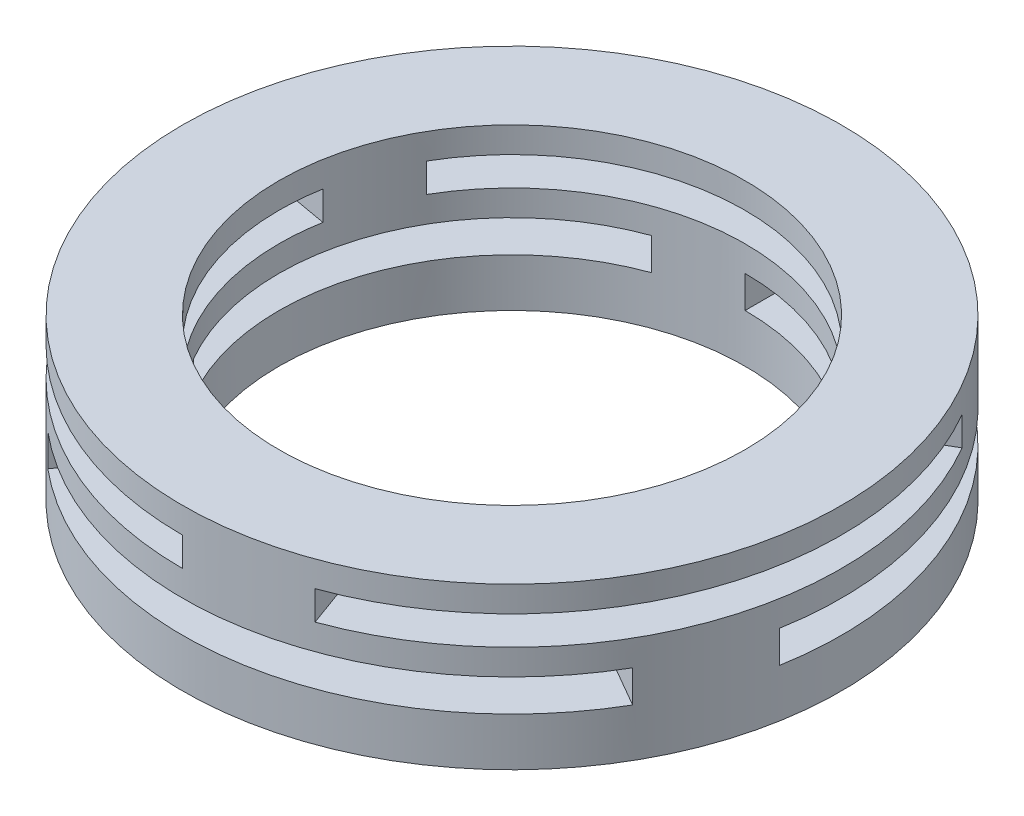
ISO-10303-21;
HEADER;
FILE_DESCRIPTION(('STEP AP214'),'2;1');
FILE_NAME('part.step','',(''),(''),'','','');
FILE_SCHEMA(('AUTOMOTIVE_DESIGN { 1 0 10303 214 1 1 1 1 }'));
ENDSEC;
DATA;
#1=APPLICATION_CONTEXT('core data for automotive mechanical design processes');
#2=APPLICATION_PROTOCOL_DEFINITION('international standard','automotive_design',2000,#1);
#3=PRODUCT_CONTEXT('',#1,'mechanical');
#4=PRODUCT('Part','Part','',(#3));
#5=PRODUCT_RELATED_PRODUCT_CATEGORY('part','',(#4));
#6=PRODUCT_DEFINITION_FORMATION('','',#4);
#7=PRODUCT_DEFINITION_CONTEXT('part definition',#1,'design');
#8=PRODUCT_DEFINITION('design','',#6,#7);
#9=PRODUCT_DEFINITION_SHAPE('','',#8);
#10=(LENGTH_UNIT() NAMED_UNIT(*) SI_UNIT(.MILLI.,.METRE.));
#11=(NAMED_UNIT(*) PLANE_ANGLE_UNIT() SI_UNIT($,.RADIAN.));
#12=(NAMED_UNIT(*) SI_UNIT($,.STERADIAN.) SOLID_ANGLE_UNIT());
#13=UNCERTAINTY_MEASURE_WITH_UNIT(LENGTH_MEASURE(1.E-05),#10,'distance_accuracy_value','');
#14=(GEOMETRIC_REPRESENTATION_CONTEXT(3) GLOBAL_UNCERTAINTY_ASSIGNED_CONTEXT((#13)) GLOBAL_UNIT_ASSIGNED_CONTEXT((#10,
#11,#12)) REPRESENTATION_CONTEXT('',''));
#15=CARTESIAN_POINT('',(0.,0.,0.));
#16=DIRECTION('',(0.,0.,1.));
#17=DIRECTION('',(1.,0.,0.));
#18=AXIS2_PLACEMENT_3D('',#15,#16,#17);
#19=CARTESIAN_POINT('',(3.86795134082924E-13,-112.760074912511,0.));
#20=DIRECTION('',(0.,1.,0.));
#21=DIRECTION('',(-1.,0.,0.));
#22=AXIS2_PLACEMENT_3D('',#19,#20,#21);
#23=CYLINDRICAL_SURFACE('',#22,7.25000000000001);
#24=DIRECTION('',(0.,1.,0.));
#25=VECTOR('',#24,1.);
#26=CARTESIAN_POINT('',(4.37504570732679E-13,-112.760074912511,7.25000000000001));
#27=LINE('',#26,#25);
#28=CARTESIAN_POINT('',(0.,4.19999999999997,7.25000000000001));
#29=VERTEX_POINT('',#28);
#30=CARTESIAN_POINT('',(0.,3.29999999999997,7.25000000000001));
#31=VERTEX_POINT('',#30);
#32=EDGE_CURVE('E239',#29,#31,#27,.F.);
#33=ORIENTED_EDGE('',*,*,#32,.F.);
#34=CARTESIAN_POINT('',(0.,4.19999999999997,0.));
#35=DIRECTION('',(0.,1.,0.));
#36=DIRECTION('',(-1.,0.,0.));
#37=AXIS2_PLACEMENT_3D('',#34,#35,#36);
#38=CIRCLE('',#37,7.25000000000001);
#39=CARTESIAN_POINT('',(-7.13985620933853,4.19999999999994,-1.25894928808522));
#40=VERTEX_POINT('',#39);
#41=EDGE_CURVE('E232',#29,#40,#38,.F.);
#42=ORIENTED_EDGE('',*,*,#41,.T.);
#43=DIRECTION('',(0.,1.,0.));
#44=VECTOR('',#43,1.);
#45=CARTESIAN_POINT('',(-7.13985620933813,-112.760074912511,-1.25894928808522));
#46=LINE('',#45,#44);
#47=CARTESIAN_POINT('',(-7.13985620933853,3.29999999999995,-1.25894928808522));
#48=VERTEX_POINT('',#47);
#49=EDGE_CURVE('E207',#48,#40,#46,.T.);
#50=ORIENTED_EDGE('',*,*,#49,.F.);
#51=CARTESIAN_POINT('',(0.,3.29999999999997,0.));
#52=DIRECTION('',(0.,1.,0.));
#53=DIRECTION('',(-1.,0.,0.));
#54=AXIS2_PLACEMENT_3D('',#51,#52,#53);
#55=CIRCLE('',#54,7.25000000000001);
#56=EDGE_CURVE('E227',#31,#48,#55,.F.);
#57=ORIENTED_EDGE('',*,*,#56,.F.);
#58=EDGE_LOOP('',(#33,#42,#50,#57));
#59=FACE_BOUND('',#58,.T.);
#60=DIRECTION('',(0.,1.,0.));
#61=VECTOR('',#60,1.);
#62=CARTESIAN_POINT('',(-6.27868417743681,-112.760074912511,-3.62499999999999));
#63=LINE('',#62,#61);
#64=CARTESIAN_POINT('',(-6.27868417743721,4.19999999999995,-3.62499999999999));
#65=VERTEX_POINT('',#64);
#66=CARTESIAN_POINT('',(-6.27868417743721,3.29999999999995,-3.62499999999999));
#67=VERTEX_POINT('',#66);
#68=EDGE_CURVE('E279',#65,#67,#63,.F.);
#69=ORIENTED_EDGE('',*,*,#68,.F.);
#70=CARTESIAN_POINT('',(0.,4.19999999999997,0.));
#71=DIRECTION('',(0.,1.,0.));
#72=DIRECTION('',(-1.,0.,0.));
#73=AXIS2_PLACEMENT_3D('',#70,#71,#72);
#74=CIRCLE('',#73,7.25000000000001);
#75=CARTESIAN_POINT('',(4.66021017022741,4.19999999999998,-5.55382221261259));
#76=VERTEX_POINT('',#75);
#77=EDGE_CURVE('E275',#65,#76,#74,.F.);
#78=ORIENTED_EDGE('',*,*,#77,.T.);
#79=DIRECTION('',(0.,1.,0.));
#80=VECTOR('',#79,1.);
#81=CARTESIAN_POINT('',(4.66021017022781,-112.760074912511,-5.55382221261259));
#82=LINE('',#81,#80);
#83=CARTESIAN_POINT('',(4.66021017022741,3.29999999999999,-5.55382221261259));
#84=VERTEX_POINT('',#83);
#85=EDGE_CURVE('E283',#84,#76,#82,.T.);
#86=ORIENTED_EDGE('',*,*,#85,.F.);
#87=CARTESIAN_POINT('',(0.,3.29999999999997,0.));
#88=DIRECTION('',(0.,1.,0.));
#89=DIRECTION('',(-1.,0.,0.));
#90=AXIS2_PLACEMENT_3D('',#87,#88,#89);
#91=CIRCLE('',#90,7.25000000000001);
#92=EDGE_CURVE('E272',#67,#84,#91,.F.);
#93=ORIENTED_EDGE('',*,*,#92,.F.);
#94=EDGE_LOOP('',(#69,#78,#86,#93));
#95=FACE_BOUND('',#94,.T.);
#96=DIRECTION('',(0.,1.,0.));
#97=VECTOR('',#96,1.);
#98=CARTESIAN_POINT('',(6.27868417743758,-112.760074912511,-3.62499999999999));
#99=LINE('',#98,#97);
#100=CARTESIAN_POINT('',(6.27868417743718,4.19999999999999,-3.62499999999999));
#101=VERTEX_POINT('',#100);
#102=CARTESIAN_POINT('',(6.27868417743718,3.29999999999999,-3.62499999999999));
#103=VERTEX_POINT('',#102);
#104=EDGE_CURVE('E321',#101,#103,#99,.F.);
#105=ORIENTED_EDGE('',*,*,#104,.F.);
#106=CARTESIAN_POINT('',(0.,4.19999999999997,0.));
#107=DIRECTION('',(0.,1.,0.));
#108=DIRECTION('',(-1.,0.,0.));
#109=AXIS2_PLACEMENT_3D('',#106,#107,#108);
#110=CIRCLE('',#109,7.25000000000001);
#111=CARTESIAN_POINT('',(2.47964603911105,4.19999999999998,6.81277150069786));
#112=VERTEX_POINT('',#111);
#113=EDGE_CURVE('E317',#101,#112,#110,.F.);
#114=ORIENTED_EDGE('',*,*,#113,.T.);
#115=DIRECTION('',(0.,1.,0.));
#116=VECTOR('',#115,1.);
#117=CARTESIAN_POINT('',(2.47964603911145,-112.760074912511,6.81277150069786));
#118=LINE('',#117,#116);
#119=CARTESIAN_POINT('',(2.47964603911105,3.29999999999998,6.81277150069786));
#120=VERTEX_POINT('',#119);
#121=EDGE_CURVE('E325',#120,#112,#118,.T.);
#122=ORIENTED_EDGE('',*,*,#121,.F.);
#123=CARTESIAN_POINT('',(0.,3.29999999999997,0.));
#124=DIRECTION('',(0.,1.,0.));
#125=DIRECTION('',(-1.,0.,0.));
#126=AXIS2_PLACEMENT_3D('',#123,#124,#125);
#127=CIRCLE('',#126,7.25000000000001);
#128=EDGE_CURVE('E314',#103,#120,#127,.F.);
#129=ORIENTED_EDGE('',*,*,#128,.F.);
#130=EDGE_LOOP('',(#105,#114,#122,#129));
#131=FACE_BOUND('',#130,.T.);
#132=DIRECTION('',(0.,1.,0.));
#133=VECTOR('',#132,1.);
#134=CARTESIAN_POINT('',(6.27868417743761,-112.760074912511,3.62499999999994));
#135=LINE('',#134,#133);
#136=CARTESIAN_POINT('',(6.27868417743721,2.5,3.62499999999994));
#137=VERTEX_POINT('',#136);
#138=CARTESIAN_POINT('',(6.27868417743722,1.5,3.62499999999994));
#139=VERTEX_POINT('',#138);
#140=EDGE_CURVE('E410',#137,#139,#135,.F.);
#141=ORIENTED_EDGE('',*,*,#140,.F.);
#142=CARTESIAN_POINT('',(0.,2.49999999999997,0.));
#143=DIRECTION('',(0.,1.,0.));
#144=DIRECTION('',(-1.,0.,0.));
#145=AXIS2_PLACEMENT_3D('',#142,#143,#144);
#146=CIRCLE('',#145,7.25000000000001);
#147=CARTESIAN_POINT('',(-4.66021017022735,2.49999999999996,5.55382221261266));
#148=VERTEX_POINT('',#147);
#149=EDGE_CURVE('E403',#137,#148,#146,.F.);
#150=ORIENTED_EDGE('',*,*,#149,.T.);
#151=DIRECTION('',(0.,1.,0.));
#152=VECTOR('',#151,1.);
#153=CARTESIAN_POINT('',(-4.66021017022695,-112.760074912511,5.55382221261266));
#154=LINE('',#153,#152);
#155=CARTESIAN_POINT('',(-4.66021017022735,1.49999999999996,5.55382221261266));
#156=VERTEX_POINT('',#155);
#157=EDGE_CURVE('E407',#156,#148,#154,.T.);
#158=ORIENTED_EDGE('',*,*,#157,.F.);
#159=CARTESIAN_POINT('',(0.,1.49999999999997,0.));
#160=DIRECTION('',(0.,1.,0.));
#161=DIRECTION('',(-1.,0.,0.));
#162=AXIS2_PLACEMENT_3D('',#159,#160,#161);
#163=CIRCLE('',#162,7.25000000000001);
#164=EDGE_CURVE('E400',#139,#156,#163,.F.);
#165=ORIENTED_EDGE('',*,*,#164,.F.);
#166=EDGE_LOOP('',(#141,#150,#158,#165));
#167=FACE_BOUND('',#166,.T.);
#168=DIRECTION('',(0.,1.,0.));
#169=VECTOR('',#168,1.);
#170=CARTESIAN_POINT('',(-6.27868417743678,-112.760074912511,3.62500000000003));
#171=LINE('',#170,#169);
#172=CARTESIAN_POINT('',(-6.27868417743718,2.49999999999995,3.62500000000003));
#173=VERTEX_POINT('',#172);
#174=CARTESIAN_POINT('',(-6.27868417743718,1.49999999999995,3.62500000000003));
#175=VERTEX_POINT('',#174);
#176=EDGE_CURVE('E396',#173,#175,#171,.F.);
#177=ORIENTED_EDGE('',*,*,#176,.F.);
#178=CARTESIAN_POINT('',(0.,2.49999999999997,0.));
#179=DIRECTION('',(0.,1.,0.));
#180=DIRECTION('',(-1.,0.,0.));
#181=AXIS2_PLACEMENT_3D('',#178,#179,#180);
#182=CIRCLE('',#181,7.25000000000001);
#183=CARTESIAN_POINT('',(-2.47964603911117,2.49999999999997,-6.81277150069782));
#184=VERTEX_POINT('',#183);
#185=EDGE_CURVE('E389',#173,#184,#182,.F.);
#186=ORIENTED_EDGE('',*,*,#185,.T.);
#187=DIRECTION('',(0.,1.,0.));
#188=VECTOR('',#187,1.);
#189=CARTESIAN_POINT('',(-2.47964603911077,-112.760074912511,-6.81277150069782));
#190=LINE('',#189,#188);
#191=CARTESIAN_POINT('',(-2.47964603911117,1.49999999999997,-6.81277150069782));
#192=VERTEX_POINT('',#191);
#193=EDGE_CURVE('E393',#192,#184,#190,.T.);
#194=ORIENTED_EDGE('',*,*,#193,.F.);
#195=CARTESIAN_POINT('',(0.,1.49999999999997,0.));
#196=DIRECTION('',(0.,1.,0.));
#197=DIRECTION('',(-1.,0.,0.));
#198=AXIS2_PLACEMENT_3D('',#195,#196,#197);
#199=CIRCLE('',#198,7.25000000000001);
#200=EDGE_CURVE('E386',#175,#192,#199,.F.);
#201=ORIENTED_EDGE('',*,*,#200,.F.);
#202=EDGE_LOOP('',(#177,#186,#194,#201));
#203=FACE_BOUND('',#202,.T.);
#204=DIRECTION('',(0.,1.,0.));
#205=VECTOR('',#204,1.);
#206=CARTESIAN_POINT('',(3.86795134082925E-13,-112.760074912511,-7.25000000000001));
#207=LINE('',#206,#205);
#208=CARTESIAN_POINT('',(0.,2.49999999999997,-7.25000000000001));
#209=VERTEX_POINT('',#208);
#210=CARTESIAN_POINT('',(0.,1.49999999999997,-7.25000000000001));
#211=VERTEX_POINT('',#210);
#212=EDGE_CURVE('E453',#209,#211,#207,.F.);
#213=ORIENTED_EDGE('',*,*,#212,.F.);
#214=CARTESIAN_POINT('',(0.,2.49999999999997,0.));
#215=DIRECTION('',(0.,1.,0.));
#216=DIRECTION('',(-1.,0.,0.));
#217=AXIS2_PLACEMENT_3D('',#214,#215,#216);
#218=CIRCLE('',#217,7.25000000000001);
#219=CARTESIAN_POINT('',(7.13985620933851,2.5,1.25894928808522));
#220=VERTEX_POINT('',#219);
#221=EDGE_CURVE('E446',#209,#220,#218,.F.);
#222=ORIENTED_EDGE('',*,*,#221,.T.);
#223=DIRECTION('',(0.,1.,0.));
#224=VECTOR('',#223,1.);
#225=CARTESIAN_POINT('',(7.13985620933891,-112.760074912511,1.25894928808522));
#226=LINE('',#225,#224);
#227=CARTESIAN_POINT('',(7.13985620933852,1.5,1.25894928808522));
#228=VERTEX_POINT('',#227);
#229=EDGE_CURVE('E450',#228,#220,#226,.T.);
#230=ORIENTED_EDGE('',*,*,#229,.F.);
#231=CARTESIAN_POINT('',(0.,1.49999999999997,0.));
#232=DIRECTION('',(0.,1.,0.));
#233=DIRECTION('',(-1.,0.,0.));
#234=AXIS2_PLACEMENT_3D('',#231,#232,#233);
#235=CIRCLE('',#234,7.25000000000001);
#236=EDGE_CURVE('E443',#211,#228,#235,.F.);
#237=ORIENTED_EDGE('',*,*,#236,.F.);
#238=EDGE_LOOP('',(#213,#222,#230,#237));
#239=FACE_BOUND('',#238,.T.);
#240=CARTESIAN_POINT('',(0.,0.,0.));
#241=DIRECTION('',(0.,1.,0.));
#242=DIRECTION('',(-1.,0.,0.));
#243=AXIS2_PLACEMENT_3D('',#240,#241,#242);
#244=CIRCLE('',#243,7.25);
#245=CARTESIAN_POINT('',(-7.25,0.,0.));
#246=VERTEX_POINT('',#245);
#247=EDGE_CURVE('E11',#246,#246,#244,.T.);
#248=ORIENTED_EDGE('',*,*,#247,.F.);
#249=EDGE_LOOP('',(#248));
#250=FACE_BOUND('',#249,.T.);
#251=CARTESIAN_POINT('',(0.,4.99999999999998,0.));
#252=DIRECTION('',(0.,1.,0.));
#253=DIRECTION('',(-1.,0.,0.));
#254=AXIS2_PLACEMENT_3D('',#251,#252,#253);
#255=CIRCLE('',#254,7.25000000000002);
#256=CARTESIAN_POINT('',(-7.25000000000003,4.99999999999995,0.));
#257=VERTEX_POINT('',#256);
#258=EDGE_CURVE('E457',#257,#257,#255,.T.);
#259=ORIENTED_EDGE('',*,*,#258,.T.);
#260=EDGE_LOOP('',(#259));
#261=FACE_BOUND('',#260,.T.);
#262=ADVANCED_FACE('F43',(#59,#95,#131,#167,#203,#239,#250,#261),#23,.F.);
#263=CARTESIAN_POINT('',(7.25,0.,0.));
#264=DIRECTION('',(0.,1.,0.));
#265=DIRECTION('',(-1.,0.,0.));
#266=AXIS2_PLACEMENT_3D('',#263,#264,#265);
#267=PLANE('',#266);
#268=CARTESIAN_POINT('',(0.,0.,0.));
#269=DIRECTION('',(0.,1.,0.));
#270=DIRECTION('',(-1.,0.,0.));
#271=AXIS2_PLACEMENT_3D('',#268,#269,#270);
#272=CIRCLE('',#271,10.25);
#273=CARTESIAN_POINT('',(-10.25,0.,0.));
#274=VERTEX_POINT('',#273);
#275=EDGE_CURVE('E51',#274,#274,#272,.T.);
#276=ORIENTED_EDGE('',*,*,#275,.F.);
#277=EDGE_LOOP('',(#276));
#278=FACE_BOUND('',#277,.T.);
#279=ORIENTED_EDGE('',*,*,#247,.T.);
#280=EDGE_LOOP('',(#279));
#281=FACE_BOUND('',#280,.T.);
#282=ADVANCED_FACE('F469',(#278,#281),#267,.F.);
#283=CARTESIAN_POINT('',(3.86795134082924E-13,-112.760074912511,0.));
#284=DIRECTION('',(0.,1.,0.));
#285=DIRECTION('',(-1.,0.,0.));
#286=AXIS2_PLACEMENT_3D('',#283,#284,#285);
#287=CYLINDRICAL_SURFACE('',#286,10.25);
#288=DIRECTION('',(0.,-1.,0.));
#289=VECTOR('',#288,1.);
#290=CARTESIAN_POINT('',(-10.0942794683752,4.19999999999994,-1.77989382108601));
#291=LINE('',#290,#289);
#292=CARTESIAN_POINT('',(-10.0942794683752,4.19999999999994,-1.77989382108601));
#293=VERTEX_POINT('',#292);
#294=CARTESIAN_POINT('',(-10.0942794683752,3.29999999999993,-1.779893821086));
#295=VERTEX_POINT('',#294);
#296=EDGE_CURVE('E66',#293,#295,#291,.T.);
#297=ORIENTED_EDGE('',*,*,#296,.F.);
#298=CARTESIAN_POINT('',(0.,4.19999999999997,0.));
#299=DIRECTION('',(0.,1.,0.));
#300=DIRECTION('',(0.499999999999992,0.,-0.866025403784443));
#301=AXIS2_PLACEMENT_3D('',#298,#299,#300);
#302=CIRCLE('',#301,10.25);
#303=CARTESIAN_POINT('',(0.,4.19999999999997,10.25));
#304=VERTEX_POINT('',#303);
#305=EDGE_CURVE('E211',#293,#304,#302,.T.);
#306=ORIENTED_EDGE('',*,*,#305,.T.);
#307=DIRECTION('',(0.,-1.,0.));
#308=VECTOR('',#307,1.);
#309=CARTESIAN_POINT('',(0.,4.19999999999997,10.25));
#310=LINE('',#309,#308);
#311=CARTESIAN_POINT('',(0.,3.29999999999997,10.25));
#312=VERTEX_POINT('',#311);
#313=EDGE_CURVE('E228',#304,#312,#310,.T.);
#314=ORIENTED_EDGE('',*,*,#313,.T.);
#315=CARTESIAN_POINT('',(0.,3.29999999999997,0.));
#316=DIRECTION('',(0.,1.,0.));
#317=DIRECTION('',(0.499999999999992,0.,-0.866025403784443));
#318=AXIS2_PLACEMENT_3D('',#315,#316,#317);
#319=CIRCLE('',#318,10.25);
#320=EDGE_CURVE('E225',#295,#312,#319,.T.);
#321=ORIENTED_EDGE('',*,*,#320,.F.);
#322=EDGE_LOOP('',(#297,#306,#314,#321));
#323=FACE_BOUND('',#322,.T.);
#324=DIRECTION('',(0.,-1.,0.));
#325=VECTOR('',#324,1.);
#326=CARTESIAN_POINT('',(6.58857299928704,4.19999999999999,-7.85195554196953));
#327=LINE('',#326,#325);
#328=CARTESIAN_POINT('',(6.58857299928704,4.19999999999999,-7.85195554196953));
#329=VERTEX_POINT('',#328);
#330=CARTESIAN_POINT('',(6.58857299928703,3.29999999999999,-7.85195554196952));
#331=VERTEX_POINT('',#330);
#332=EDGE_CURVE('E269',#329,#331,#327,.T.);
#333=ORIENTED_EDGE('',*,*,#332,.F.);
#334=CARTESIAN_POINT('',(0.,4.19999999999997,0.));
#335=DIRECTION('',(0.,1.,0.));
#336=DIRECTION('',(0.500000000000004,0.,0.866025403784436));
#337=AXIS2_PLACEMENT_3D('',#334,#335,#336);
#338=CIRCLE('',#337,10.25);
#339=CARTESIAN_POINT('',(-8.87676038879054,4.19999999999994,-5.12499999999999));
#340=VERTEX_POINT('',#339);
#341=EDGE_CURVE('E248',#329,#340,#338,.T.);
#342=ORIENTED_EDGE('',*,*,#341,.T.);
#343=DIRECTION('',(0.,-1.,0.));
#344=VECTOR('',#343,1.);
#345=CARTESIAN_POINT('',(-8.87676038879054,4.19999999999994,-5.12499999999999));
#346=LINE('',#345,#344);
#347=CARTESIAN_POINT('',(-8.87676038879053,3.29999999999994,-5.12499999999999));
#348=VERTEX_POINT('',#347);
#349=EDGE_CURVE('E257',#340,#348,#346,.T.);
#350=ORIENTED_EDGE('',*,*,#349,.T.);
#351=CARTESIAN_POINT('',(0.,3.29999999999997,0.));
#352=DIRECTION('',(0.,1.,0.));
#353=DIRECTION('',(0.500000000000004,0.,0.866025403784436));
#354=AXIS2_PLACEMENT_3D('',#351,#352,#353);
#355=CIRCLE('',#354,10.25);
#356=EDGE_CURVE('E261',#331,#348,#355,.T.);
#357=ORIENTED_EDGE('',*,*,#356,.F.);
#358=EDGE_LOOP('',(#333,#342,#350,#357));
#359=FACE_BOUND('',#358,.T.);
#360=DIRECTION('',(0.,-1.,0.));
#361=VECTOR('',#360,1.);
#362=CARTESIAN_POINT('',(3.50570646908804,4.19999999999998,9.6318493630556));
#363=LINE('',#362,#361);
#364=CARTESIAN_POINT('',(3.50570646908804,4.19999999999998,9.6318493630556));
#365=VERTEX_POINT('',#364);
#366=CARTESIAN_POINT('',(3.50570646908804,3.29999999999998,9.63184936305559));
#367=VERTEX_POINT('',#366);
#368=EDGE_CURVE('E311',#365,#367,#363,.T.);
#369=ORIENTED_EDGE('',*,*,#368,.F.);
#370=CARTESIAN_POINT('',(0.,4.19999999999997,0.));
#371=DIRECTION('',(0.,1.,0.));
#372=DIRECTION('',(-1.,0.,0.));
#373=AXIS2_PLACEMENT_3D('',#370,#371,#372);
#374=CIRCLE('',#373,10.25);
#375=CARTESIAN_POINT('',(8.87676038879051,4.2,-5.12499999999999));
#376=VERTEX_POINT('',#375);
#377=EDGE_CURVE('E290',#365,#376,#374,.T.);
#378=ORIENTED_EDGE('',*,*,#377,.T.);
#379=DIRECTION('',(0.,-1.,0.));
#380=VECTOR('',#379,1.);
#381=CARTESIAN_POINT('',(8.87676038879051,4.2,-5.12499999999999));
#382=LINE('',#381,#380);
#383=CARTESIAN_POINT('',(8.87676038879051,3.3,-5.12499999999999));
#384=VERTEX_POINT('',#383);
#385=EDGE_CURVE('E299',#376,#384,#382,.T.);
#386=ORIENTED_EDGE('',*,*,#385,.T.);
#387=CARTESIAN_POINT('',(0.,3.29999999999997,0.));
#388=DIRECTION('',(0.,1.,0.));
#389=DIRECTION('',(-1.,0.,0.));
#390=AXIS2_PLACEMENT_3D('',#387,#388,#389);
#391=CIRCLE('',#390,10.25);
#392=EDGE_CURVE('E303',#367,#384,#391,.T.);
#393=ORIENTED_EDGE('',*,*,#392,.F.);
#394=EDGE_LOOP('',(#369,#378,#386,#393));
#395=FACE_BOUND('',#394,.T.);
#396=DIRECTION('',(0.,-1.,0.));
#397=VECTOR('',#396,1.);
#398=CARTESIAN_POINT('',(-6.58857299928694,2.49999999999995,7.85195554196962));
#399=LINE('',#398,#397);
#400=CARTESIAN_POINT('',(-6.58857299928694,2.49999999999995,7.85195554196962));
#401=VERTEX_POINT('',#400);
#402=CARTESIAN_POINT('',(-6.58857299928693,1.49999999999995,7.85195554196962));
#403=VERTEX_POINT('',#402);
#404=EDGE_CURVE('E341',#401,#403,#399,.T.);
#405=ORIENTED_EDGE('',*,*,#404,.F.);
#406=CARTESIAN_POINT('',(0.,2.49999999999997,0.));
#407=DIRECTION('',(0.,1.,0.));
#408=DIRECTION('',(0.499999999999992,0.,-0.866025403784443));
#409=AXIS2_PLACEMENT_3D('',#406,#407,#408);
#410=CIRCLE('',#409,10.25);
#411=CARTESIAN_POINT('',(8.87676038879055,2.5,5.12499999999993));
#412=VERTEX_POINT('',#411);
#413=EDGE_CURVE('E329',#401,#412,#410,.T.);
#414=ORIENTED_EDGE('',*,*,#413,.T.);
#415=DIRECTION('',(0.,-1.,0.));
#416=VECTOR('',#415,1.);
#417=CARTESIAN_POINT('',(8.87676038879055,2.5,5.12499999999993));
#418=LINE('',#417,#416);
#419=CARTESIAN_POINT('',(8.87676038879055,1.5,5.12499999999993));
#420=VERTEX_POINT('',#419);
#421=EDGE_CURVE('E353',#412,#420,#418,.T.);
#422=ORIENTED_EDGE('',*,*,#421,.T.);
#423=CARTESIAN_POINT('',(0.,1.49999999999997,0.));
#424=DIRECTION('',(0.,1.,0.));
#425=DIRECTION('',(0.499999999999992,0.,-0.866025403784443));
#426=AXIS2_PLACEMENT_3D('',#423,#424,#425);
#427=CIRCLE('',#426,10.25);
#428=EDGE_CURVE('E328',#403,#420,#427,.T.);
#429=ORIENTED_EDGE('',*,*,#428,.F.);
#430=EDGE_LOOP('',(#405,#414,#422,#429));
#431=FACE_BOUND('',#430,.T.);
#432=DIRECTION('',(0.,-1.,0.));
#433=VECTOR('',#432,1.);
#434=CARTESIAN_POINT('',(-3.5057064690882,2.49999999999996,-9.63184936305555));
#435=LINE('',#434,#433);
#436=CARTESIAN_POINT('',(-3.5057064690882,2.49999999999996,-9.63184936305555));
#437=VERTEX_POINT('',#436);
#438=CARTESIAN_POINT('',(-3.5057064690882,1.49999999999996,-9.63184936305554));
#439=VERTEX_POINT('',#438);
#440=EDGE_CURVE('E370',#437,#439,#435,.T.);
#441=ORIENTED_EDGE('',*,*,#440,.F.);
#442=CARTESIAN_POINT('',(0.,2.49999999999997,0.));
#443=DIRECTION('',(0.,1.,0.));
#444=DIRECTION('',(0.500000000000004,0.,0.866025403784436));
#445=AXIS2_PLACEMENT_3D('',#442,#443,#444);
#446=CIRCLE('',#445,10.25);
#447=CARTESIAN_POINT('',(-8.8767603887905,2.49999999999994,5.12500000000005));
#448=VERTEX_POINT('',#447);
#449=EDGE_CURVE('E358',#437,#448,#446,.T.);
#450=ORIENTED_EDGE('',*,*,#449,.T.);
#451=DIRECTION('',(0.,-1.,0.));
#452=VECTOR('',#451,1.);
#453=CARTESIAN_POINT('',(-8.8767603887905,2.49999999999994,5.12500000000005));
#454=LINE('',#453,#452);
#455=CARTESIAN_POINT('',(-8.87676038879049,1.49999999999994,5.12500000000005));
#456=VERTEX_POINT('',#455);
#457=EDGE_CURVE('E382',#448,#456,#454,.T.);
#458=ORIENTED_EDGE('',*,*,#457,.T.);
#459=CARTESIAN_POINT('',(0.,1.49999999999997,0.));
#460=DIRECTION('',(0.,1.,0.));
#461=DIRECTION('',(0.500000000000004,0.,0.866025403784436));
#462=AXIS2_PLACEMENT_3D('',#459,#460,#461);
#463=CIRCLE('',#462,10.25);
#464=EDGE_CURVE('E357',#439,#456,#463,.T.);
#465=ORIENTED_EDGE('',*,*,#464,.F.);
#466=EDGE_LOOP('',(#441,#450,#458,#465));
#467=FACE_BOUND('',#466,.T.);
#468=DIRECTION('',(0.,-1.,0.));
#469=VECTOR('',#468,1.);
#470=CARTESIAN_POINT('',(10.0942794683751,2.5,1.779893821086));
#471=LINE('',#470,#469);
#472=CARTESIAN_POINT('',(10.0942794683751,2.5,1.779893821086));
#473=VERTEX_POINT('',#472);
#474=CARTESIAN_POINT('',(10.0942794683751,1.50000000000001,1.779893821086));
#475=VERTEX_POINT('',#474);
#476=EDGE_CURVE('E427',#473,#475,#471,.T.);
#477=ORIENTED_EDGE('',*,*,#476,.F.);
#478=CARTESIAN_POINT('',(0.,2.49999999999997,0.));
#479=DIRECTION('',(0.,1.,0.));
#480=DIRECTION('',(-1.,0.,0.));
#481=AXIS2_PLACEMENT_3D('',#478,#479,#480);
#482=CIRCLE('',#481,10.25);
#483=CARTESIAN_POINT('',(0.,2.49999999999997,-10.25));
#484=VERTEX_POINT('',#483);
#485=EDGE_CURVE('E415',#473,#484,#482,.T.);
#486=ORIENTED_EDGE('',*,*,#485,.T.);
#487=DIRECTION('',(0.,-1.,0.));
#488=VECTOR('',#487,1.);
#489=CARTESIAN_POINT('',(0.,2.49999999999997,-10.25));
#490=LINE('',#489,#488);
#491=CARTESIAN_POINT('',(0.,1.49999999999997,-10.25));
#492=VERTEX_POINT('',#491);
#493=EDGE_CURVE('E439',#484,#492,#490,.T.);
#494=ORIENTED_EDGE('',*,*,#493,.T.);
#495=CARTESIAN_POINT('',(0.,1.49999999999997,0.));
#496=DIRECTION('',(0.,1.,0.));
#497=DIRECTION('',(-1.,0.,0.));
#498=AXIS2_PLACEMENT_3D('',#495,#496,#497);
#499=CIRCLE('',#498,10.25);
#500=EDGE_CURVE('E414',#475,#492,#499,.T.);
#501=ORIENTED_EDGE('',*,*,#500,.F.);
#502=EDGE_LOOP('',(#477,#486,#494,#501));
#503=FACE_BOUND('',#502,.T.);
#504=CARTESIAN_POINT('',(0.,4.99999999999996,0.));
#505=DIRECTION('',(0.,1.,0.));
#506=DIRECTION('',(-1.,0.,0.));
#507=AXIS2_PLACEMENT_3D('',#504,#505,#506);
#508=CIRCLE('',#507,10.25);
#509=CARTESIAN_POINT('',(-10.25,4.99999999999993,0.));
#510=VERTEX_POINT('',#509);
#511=EDGE_CURVE('E461',#510,#510,#508,.T.);
#512=ORIENTED_EDGE('',*,*,#511,.F.);
#513=EDGE_LOOP('',(#512));
#514=FACE_BOUND('',#513,.T.);
#515=ORIENTED_EDGE('',*,*,#275,.T.);
#516=EDGE_LOOP('',(#515));
#517=FACE_BOUND('',#516,.T.);
#518=ADVANCED_FACE('F223',(#323,#359,#395,#431,#467,#503,#514,#517),#287,.T.);
#519=CARTESIAN_POINT('',(10.25,5.00000000000001,0.));
#520=DIRECTION('',(0.,-1.,0.));
#521=DIRECTION('',(1.,0.,0.));
#522=AXIS2_PLACEMENT_3D('',#519,#520,#521);
#523=PLANE('',#522);
#524=ORIENTED_EDGE('',*,*,#258,.F.);
#525=EDGE_LOOP('',(#524));
#526=FACE_BOUND('',#525,.T.);
#527=ORIENTED_EDGE('',*,*,#511,.T.);
#528=EDGE_LOOP('',(#527));
#529=FACE_BOUND('',#528,.T.);
#530=ADVANCED_FACE('F479',(#526,#529),#523,.F.);
#531=CARTESIAN_POINT('',(0.,2.49999999999997,-10.25));
#532=DIRECTION('',(1.,0.,0.));
#533=DIRECTION('',(0.,1.,0.));
#534=AXIS2_PLACEMENT_3D('',#531,#532,#533);
#535=PLANE('',#534);
#536=ORIENTED_EDGE('',*,*,#212,.T.);
#537=DIRECTION('',(0.,0.,1.));
#538=VECTOR('',#537,1.);
#539=CARTESIAN_POINT('',(0.,1.49999999999997,-10.25));
#540=LINE('',#539,#538);
#541=EDGE_CURVE('E431',#492,#211,#540,.T.);
#542=ORIENTED_EDGE('',*,*,#541,.F.);
#543=ORIENTED_EDGE('',*,*,#493,.F.);
#544=DIRECTION('',(0.,0.,1.));
#545=VECTOR('',#544,1.);
#546=CARTESIAN_POINT('',(0.,2.49999999999997,-10.25));
#547=LINE('',#546,#545);
#548=EDGE_CURVE('E419',#484,#209,#547,.T.);
#549=ORIENTED_EDGE('',*,*,#548,.T.);
#550=EDGE_LOOP('',(#536,#542,#543,#549));
#551=FACE_BOUND('',#550,.T.);
#552=ADVANCED_FACE('F482',(#551),#535,.T.);
#553=CARTESIAN_POINT('',(5.41644264156716,2.49999999999999,0.955064977168098));
#554=DIRECTION('',(0.173648177666927,0.,-0.984807753012209));
#555=DIRECTION('',(-0.984807753012209,0.,-0.173648177666926));
#556=AXIS2_PLACEMENT_3D('',#553,#554,#555);
#557=PLANE('',#556);
#558=ORIENTED_EDGE('',*,*,#229,.T.);
#559=DIRECTION('',(0.984807753012209,0.,0.173648177666926));
#560=VECTOR('',#559,1.);
#561=CARTESIAN_POINT('',(5.41644264156716,2.49999999999999,0.955064977168098));
#562=LINE('',#561,#560);
#563=EDGE_CURVE('E424',#220,#473,#562,.T.);
#564=ORIENTED_EDGE('',*,*,#563,.T.);
#565=ORIENTED_EDGE('',*,*,#476,.T.);
#566=DIRECTION('',(0.984807753012209,0.,0.173648177666926));
#567=VECTOR('',#566,1.);
#568=CARTESIAN_POINT('',(5.41644264156716,1.49999999999999,0.955064977168098));
#569=LINE('',#568,#567);
#570=EDGE_CURVE('E420',#228,#475,#569,.T.);
#571=ORIENTED_EDGE('',*,*,#570,.F.);
#572=EDGE_LOOP('',(#558,#564,#565,#571));
#573=FACE_BOUND('',#572,.T.);
#574=ADVANCED_FACE('F493',(#573),#557,.T.);
#575=CARTESIAN_POINT('',(0.,2.49999999999997,0.));
#576=DIRECTION('',(0.,1.,0.));
#577=DIRECTION('',(-1.,0.,0.));
#578=AXIS2_PLACEMENT_3D('',#575,#576,#577);
#579=PLANE('',#578);
#580=ORIENTED_EDGE('',*,*,#548,.F.);
#581=ORIENTED_EDGE('',*,*,#485,.F.);
#582=ORIENTED_EDGE('',*,*,#563,.F.);
#583=ORIENTED_EDGE('',*,*,#221,.F.);
#584=EDGE_LOOP('',(#580,#581,#582,#583));
#585=FACE_BOUND('',#584,.T.);
#586=ADVANCED_FACE('F497',(#585),#579,.F.);
#587=CARTESIAN_POINT('',(0.,1.49999999999997,0.));
#588=DIRECTION('',(0.,1.,0.));
#589=DIRECTION('',(-1.,0.,0.));
#590=AXIS2_PLACEMENT_3D('',#587,#588,#589);
#591=PLANE('',#590);
#592=ORIENTED_EDGE('',*,*,#236,.T.);
#593=ORIENTED_EDGE('',*,*,#570,.T.);
#594=ORIENTED_EDGE('',*,*,#500,.T.);
#595=ORIENTED_EDGE('',*,*,#541,.T.);
#596=EDGE_LOOP('',(#592,#593,#594,#595));
#597=FACE_BOUND('',#596,.T.);
#598=ADVANCED_FACE('F499',(#597),#591,.T.);
#599=CARTESIAN_POINT('',(-8.8767603887905,2.49999999999994,5.12500000000005));
#600=DIRECTION('',(-0.500000000000004,0.,-0.866025403784436));
#601=DIRECTION('',(-0.866025403784436,0.,0.500000000000004));
#602=AXIS2_PLACEMENT_3D('',#599,#600,#601);
#603=PLANE('',#602);
#604=ORIENTED_EDGE('',*,*,#176,.T.);
#605=DIRECTION('',(0.866025403784436,0.,-0.500000000000004));
#606=VECTOR('',#605,1.);
#607=CARTESIAN_POINT('',(-8.87676038879049,1.49999999999994,5.12500000000005));
#608=LINE('',#607,#606);
#609=EDGE_CURVE('E374',#456,#175,#608,.T.);
#610=ORIENTED_EDGE('',*,*,#609,.F.);
#611=ORIENTED_EDGE('',*,*,#457,.F.);
#612=DIRECTION('',(0.866025403784436,0.,-0.500000000000004));
#613=VECTOR('',#612,1.);
#614=CARTESIAN_POINT('',(-8.8767603887905,2.49999999999994,5.12500000000005));
#615=LINE('',#614,#613);
#616=EDGE_CURVE('E362',#448,#173,#615,.T.);
#617=ORIENTED_EDGE('',*,*,#616,.T.);
#618=EDGE_LOOP('',(#604,#610,#611,#617));
#619=FACE_BOUND('',#618,.T.);
#620=ADVANCED_FACE('F502',(#619),#603,.T.);
#621=CARTESIAN_POINT('',(-1.88111078829124,2.49999999999996,-5.1683094143225));
#622=DIRECTION('',(-0.939692620785906,0.,0.342020143325677));
#623=DIRECTION('',(0.342020143325677,0.,0.939692620785906));
#624=AXIS2_PLACEMENT_3D('',#621,#622,#623);
#625=PLANE('',#624);
#626=ORIENTED_EDGE('',*,*,#193,.T.);
#627=DIRECTION('',(-0.342020143325677,0.,-0.939692620785906));
#628=VECTOR('',#627,1.);
#629=CARTESIAN_POINT('',(-1.88111078829124,2.49999999999996,-5.1683094143225));
#630=LINE('',#629,#628);
#631=EDGE_CURVE('E367',#184,#437,#630,.T.);
#632=ORIENTED_EDGE('',*,*,#631,.T.);
#633=ORIENTED_EDGE('',*,*,#440,.T.);
#634=DIRECTION('',(-0.342020143325677,0.,-0.939692620785906));
#635=VECTOR('',#634,1.);
#636=CARTESIAN_POINT('',(-1.88111078829123,1.49999999999996,-5.1683094143225));
#637=LINE('',#636,#635);
#638=EDGE_CURVE('E363',#192,#439,#637,.T.);
#639=ORIENTED_EDGE('',*,*,#638,.F.);
#640=EDGE_LOOP('',(#626,#632,#633,#639));
#641=FACE_BOUND('',#640,.T.);
#642=ADVANCED_FACE('F509',(#641),#625,.T.);
#643=CARTESIAN_POINT('',(0.,2.49999999999997,0.));
#644=DIRECTION('',(0.,1.,0.));
#645=DIRECTION('',(0.500000000000004,0.,0.866025403784436));
#646=AXIS2_PLACEMENT_3D('',#643,#644,#645);
#647=PLANE('',#646);
#648=ORIENTED_EDGE('',*,*,#616,.F.);
#649=ORIENTED_EDGE('',*,*,#449,.F.);
#650=ORIENTED_EDGE('',*,*,#631,.F.);
#651=ORIENTED_EDGE('',*,*,#185,.F.);
#652=EDGE_LOOP('',(#648,#649,#650,#651));
#653=FACE_BOUND('',#652,.T.);
#654=ADVANCED_FACE('F513',(#653),#647,.F.);
#655=CARTESIAN_POINT('',(0.,1.49999999999997,0.));
#656=DIRECTION('',(0.,1.,0.));
#657=DIRECTION('',(0.500000000000004,0.,0.866025403784436));
#658=AXIS2_PLACEMENT_3D('',#655,#656,#657);
#659=PLANE('',#658);
#660=ORIENTED_EDGE('',*,*,#200,.T.);
#661=ORIENTED_EDGE('',*,*,#638,.T.);
#662=ORIENTED_EDGE('',*,*,#464,.T.);
#663=ORIENTED_EDGE('',*,*,#609,.T.);
#664=EDGE_LOOP('',(#660,#661,#662,#663));
#665=FACE_BOUND('',#664,.T.);
#666=ADVANCED_FACE('F515',(#665),#659,.T.);
#667=CARTESIAN_POINT('',(8.87676038879055,2.5,5.12499999999993));
#668=DIRECTION('',(-0.499999999999992,0.,0.866025403784443));
#669=DIRECTION('',(0.866025403784443,0.,0.499999999999992));
#670=AXIS2_PLACEMENT_3D('',#667,#668,#669);
#671=PLANE('',#670);
#672=ORIENTED_EDGE('',*,*,#140,.T.);
#673=DIRECTION('',(-0.866025403784443,0.,-0.499999999999992));
#674=VECTOR('',#673,1.);
#675=CARTESIAN_POINT('',(8.87676038879055,1.5,5.12499999999993));
#676=LINE('',#675,#674);
#677=EDGE_CURVE('E345',#420,#139,#676,.T.);
#678=ORIENTED_EDGE('',*,*,#677,.F.);
#679=ORIENTED_EDGE('',*,*,#421,.F.);
#680=DIRECTION('',(-0.866025403784443,0.,-0.499999999999992));
#681=VECTOR('',#680,1.);
#682=CARTESIAN_POINT('',(8.87676038879055,2.5,5.12499999999993));
#683=LINE('',#682,#681);
#684=EDGE_CURVE('E333',#412,#137,#683,.T.);
#685=ORIENTED_EDGE('',*,*,#684,.T.);
#686=EDGE_LOOP('',(#672,#678,#679,#685));
#687=FACE_BOUND('',#686,.T.);
#688=ADVANCED_FACE('F518',(#687),#671,.T.);
#689=CARTESIAN_POINT('',(-3.53533185327593,2.49999999999996,4.21324443715444));
#690=DIRECTION('',(0.766044443118986,0.,0.642787609686529));
#691=DIRECTION('',(0.642787609686529,0.,-0.766044443118987));
#692=AXIS2_PLACEMENT_3D('',#689,#690,#691);
#693=PLANE('',#692);
#694=ORIENTED_EDGE('',*,*,#157,.T.);
#695=DIRECTION('',(-0.642787609686529,0.,0.766044443118986));
#696=VECTOR('',#695,1.);
#697=CARTESIAN_POINT('',(-3.53533185327593,2.49999999999996,4.21324443715444));
#698=LINE('',#697,#696);
#699=EDGE_CURVE('E338',#148,#401,#698,.T.);
#700=ORIENTED_EDGE('',*,*,#699,.T.);
#701=ORIENTED_EDGE('',*,*,#404,.T.);
#702=DIRECTION('',(-0.642787609686529,0.,0.766044443118986));
#703=VECTOR('',#702,1.);
#704=CARTESIAN_POINT('',(-3.53533185327593,1.49999999999996,4.21324443715444));
#705=LINE('',#704,#703);
#706=EDGE_CURVE('E334',#156,#403,#705,.T.);
#707=ORIENTED_EDGE('',*,*,#706,.F.);
#708=EDGE_LOOP('',(#694,#700,#701,#707));
#709=FACE_BOUND('',#708,.T.);
#710=ADVANCED_FACE('F525',(#709),#693,.T.);
#711=CARTESIAN_POINT('',(0.,2.49999999999997,0.));
#712=DIRECTION('',(0.,1.,0.));
#713=DIRECTION('',(0.499999999999992,0.,-0.866025403784443));
#714=AXIS2_PLACEMENT_3D('',#711,#712,#713);
#715=PLANE('',#714);
#716=ORIENTED_EDGE('',*,*,#684,.F.);
#717=ORIENTED_EDGE('',*,*,#413,.F.);
#718=ORIENTED_EDGE('',*,*,#699,.F.);
#719=ORIENTED_EDGE('',*,*,#149,.F.);
#720=EDGE_LOOP('',(#716,#717,#718,#719));
#721=FACE_BOUND('',#720,.T.);
#722=ADVANCED_FACE('F529',(#721),#715,.F.);
#723=CARTESIAN_POINT('',(0.,1.49999999999997,0.));
#724=DIRECTION('',(0.,1.,0.));
#725=DIRECTION('',(0.499999999999992,0.,-0.866025403784443));
#726=AXIS2_PLACEMENT_3D('',#723,#724,#725);
#727=PLANE('',#726);
#728=ORIENTED_EDGE('',*,*,#164,.T.);
#729=ORIENTED_EDGE('',*,*,#706,.T.);
#730=ORIENTED_EDGE('',*,*,#428,.T.);
#731=ORIENTED_EDGE('',*,*,#677,.T.);
#732=EDGE_LOOP('',(#728,#729,#730,#731));
#733=FACE_BOUND('',#732,.T.);
#734=ADVANCED_FACE('F531',(#733),#727,.T.);
#735=CARTESIAN_POINT('',(0.,4.19999999999997,0.));
#736=DIRECTION('',(0.93969262078591,0.,-0.342020143325663));
#737=DIRECTION('',(-0.342020143325663,0.,-0.939692620785911));
#738=AXIS2_PLACEMENT_3D('',#735,#736,#737);
#739=PLANE('',#738);
#740=ORIENTED_EDGE('',*,*,#121,.T.);
#741=DIRECTION('',(0.342020143325663,0.,0.93969262078591));
#742=VECTOR('',#741,1.);
#743=CARTESIAN_POINT('',(0.,4.19999999999997,0.));
#744=LINE('',#743,#742);
#745=EDGE_CURVE('E287',#112,#365,#744,.T.);
#746=ORIENTED_EDGE('',*,*,#745,.T.);
#747=ORIENTED_EDGE('',*,*,#368,.T.);
#748=DIRECTION('',(0.342020143325663,0.,0.93969262078591));
#749=VECTOR('',#748,1.);
#750=CARTESIAN_POINT('',(0.,3.29999999999997,0.));
#751=LINE('',#750,#749);
#752=EDGE_CURVE('E286',#120,#367,#751,.T.);
#753=ORIENTED_EDGE('',*,*,#752,.F.);
#754=EDGE_LOOP('',(#740,#746,#747,#753));
#755=FACE_BOUND('',#754,.T.);
#756=ADVANCED_FACE('F534',(#755),#739,.T.);
#757=CARTESIAN_POINT('',(0.,4.19999999999997,0.));
#758=DIRECTION('',(0.499999999999998,0.,0.86602540378444));
#759=DIRECTION('',(0.86602540378444,0.,-0.499999999999998));
#760=AXIS2_PLACEMENT_3D('',#757,#758,#759);
#761=PLANE('',#760);
#762=ORIENTED_EDGE('',*,*,#104,.T.);
#763=DIRECTION('',(-0.86602540378444,0.,0.499999999999998));
#764=VECTOR('',#763,1.);
#765=CARTESIAN_POINT('',(0.,3.29999999999997,0.));
#766=LINE('',#765,#764);
#767=EDGE_CURVE('E291',#384,#103,#766,.T.);
#768=ORIENTED_EDGE('',*,*,#767,.F.);
#769=ORIENTED_EDGE('',*,*,#385,.F.);
#770=DIRECTION('',(-0.86602540378444,0.,0.499999999999998));
#771=VECTOR('',#770,1.);
#772=CARTESIAN_POINT('',(0.,4.19999999999997,0.));
#773=LINE('',#772,#771);
#774=EDGE_CURVE('E295',#376,#101,#773,.T.);
#775=ORIENTED_EDGE('',*,*,#774,.T.);
#776=EDGE_LOOP('',(#762,#768,#769,#775));
#777=FACE_BOUND('',#776,.T.);
#778=ADVANCED_FACE('F541',(#777),#761,.T.);
#779=CARTESIAN_POINT('',(0.,4.19999999999997,0.));
#780=DIRECTION('',(0.,1.,0.));
#781=DIRECTION('',(-1.,0.,0.));
#782=AXIS2_PLACEMENT_3D('',#779,#780,#781);
#783=PLANE('',#782);
#784=ORIENTED_EDGE('',*,*,#774,.F.);
#785=ORIENTED_EDGE('',*,*,#377,.F.);
#786=ORIENTED_EDGE('',*,*,#745,.F.);
#787=ORIENTED_EDGE('',*,*,#113,.F.);
#788=EDGE_LOOP('',(#784,#785,#786,#787));
#789=FACE_BOUND('',#788,.T.);
#790=ADVANCED_FACE('F545',(#789),#783,.F.);
#791=CARTESIAN_POINT('',(0.,3.29999999999997,0.));
#792=DIRECTION('',(0.,1.,0.));
#793=DIRECTION('',(-1.,0.,0.));
#794=AXIS2_PLACEMENT_3D('',#791,#792,#793);
#795=PLANE('',#794);
#796=ORIENTED_EDGE('',*,*,#128,.T.);
#797=ORIENTED_EDGE('',*,*,#752,.T.);
#798=ORIENTED_EDGE('',*,*,#392,.T.);
#799=ORIENTED_EDGE('',*,*,#767,.T.);
#800=EDGE_LOOP('',(#796,#797,#798,#799));
#801=FACE_BOUND('',#800,.T.);
#802=ADVANCED_FACE('F547',(#801),#795,.T.);
#803=CARTESIAN_POINT('',(0.,4.19999999999997,0.));
#804=DIRECTION('',(-0.766044443118977,0.,-0.64278760968654));
#805=DIRECTION('',(-0.64278760968654,0.,0.766044443118977));
#806=AXIS2_PLACEMENT_3D('',#803,#804,#805);
#807=PLANE('',#806);
#808=ORIENTED_EDGE('',*,*,#85,.T.);
#809=DIRECTION('',(0.642787609686541,0.,-0.766044443118977));
#810=VECTOR('',#809,1.);
#811=CARTESIAN_POINT('',(0.,4.19999999999997,0.));
#812=LINE('',#811,#810);
#813=EDGE_CURVE('E245',#76,#329,#812,.T.);
#814=ORIENTED_EDGE('',*,*,#813,.T.);
#815=ORIENTED_EDGE('',*,*,#332,.T.);
#816=DIRECTION('',(0.642787609686541,0.,-0.766044443118977));
#817=VECTOR('',#816,1.);
#818=CARTESIAN_POINT('',(0.,3.29999999999997,0.));
#819=LINE('',#818,#817);
#820=EDGE_CURVE('E244',#84,#331,#819,.T.);
#821=ORIENTED_EDGE('',*,*,#820,.F.);
#822=EDGE_LOOP('',(#808,#814,#815,#821));
#823=FACE_BOUND('',#822,.T.);
#824=ADVANCED_FACE('F550',(#823),#807,.T.);
#825=CARTESIAN_POINT('',(0.,4.19999999999997,0.));
#826=DIRECTION('',(0.499999999999998,0.,-0.86602540378444));
#827=DIRECTION('',(-0.86602540378444,0.,-0.499999999999998));
#828=AXIS2_PLACEMENT_3D('',#825,#826,#827);
#829=PLANE('',#828);
#830=ORIENTED_EDGE('',*,*,#68,.T.);
#831=DIRECTION('',(0.86602540378444,0.,0.499999999999998));
#832=VECTOR('',#831,1.);
#833=CARTESIAN_POINT('',(0.,3.29999999999997,0.));
#834=LINE('',#833,#832);
#835=EDGE_CURVE('E249',#348,#67,#834,.T.);
#836=ORIENTED_EDGE('',*,*,#835,.F.);
#837=ORIENTED_EDGE('',*,*,#349,.F.);
#838=DIRECTION('',(0.86602540378444,0.,0.499999999999998));
#839=VECTOR('',#838,1.);
#840=CARTESIAN_POINT('',(0.,4.19999999999997,0.));
#841=LINE('',#840,#839);
#842=EDGE_CURVE('E253',#340,#65,#841,.T.);
#843=ORIENTED_EDGE('',*,*,#842,.T.);
#844=EDGE_LOOP('',(#830,#836,#837,#843));
#845=FACE_BOUND('',#844,.T.);
#846=ADVANCED_FACE('F557',(#845),#829,.T.);
#847=CARTESIAN_POINT('',(0.,4.19999999999997,0.));
#848=DIRECTION('',(0.,1.,0.));
#849=DIRECTION('',(0.500000000000004,0.,0.866025403784436));
#850=AXIS2_PLACEMENT_3D('',#847,#848,#849);
#851=PLANE('',#850);
#852=ORIENTED_EDGE('',*,*,#842,.F.);
#853=ORIENTED_EDGE('',*,*,#341,.F.);
#854=ORIENTED_EDGE('',*,*,#813,.F.);
#855=ORIENTED_EDGE('',*,*,#77,.F.);
#856=EDGE_LOOP('',(#852,#853,#854,#855));
#857=FACE_BOUND('',#856,.T.);
#858=ADVANCED_FACE('F561',(#857),#851,.F.);
#859=CARTESIAN_POINT('',(0.,3.29999999999997,0.));
#860=DIRECTION('',(0.,1.,0.));
#861=DIRECTION('',(0.500000000000004,0.,0.866025403784436));
#862=AXIS2_PLACEMENT_3D('',#859,#860,#861);
#863=PLANE('',#862);
#864=ORIENTED_EDGE('',*,*,#92,.T.);
#865=ORIENTED_EDGE('',*,*,#820,.T.);
#866=ORIENTED_EDGE('',*,*,#356,.T.);
#867=ORIENTED_EDGE('',*,*,#835,.T.);
#868=EDGE_LOOP('',(#864,#865,#866,#867));
#869=FACE_BOUND('',#868,.T.);
#870=ADVANCED_FACE('F563',(#869),#863,.T.);
#871=CARTESIAN_POINT('',(0.,4.19999999999997,0.));
#872=DIRECTION('',(-0.173648177666927,0.,0.984807753012209));
#873=DIRECTION('',(0.984807753012209,0.,0.173648177666927));
#874=AXIS2_PLACEMENT_3D('',#871,#872,#873);
#875=PLANE('',#874);
#876=ORIENTED_EDGE('',*,*,#49,.T.);
#877=DIRECTION('',(-0.984807753012209,0.,-0.173648177666927));
#878=VECTOR('',#877,1.);
#879=CARTESIAN_POINT('',(0.,4.19999999999997,0.));
#880=LINE('',#879,#878);
#881=EDGE_CURVE('E203',#40,#293,#880,.T.);
#882=ORIENTED_EDGE('',*,*,#881,.T.);
#883=ORIENTED_EDGE('',*,*,#296,.T.);
#884=DIRECTION('',(-0.984807753012209,0.,-0.173648177666927));
#885=VECTOR('',#884,1.);
#886=CARTESIAN_POINT('',(0.,3.29999999999997,0.));
#887=LINE('',#886,#885);
#888=EDGE_CURVE('E803',#48,#295,#887,.T.);
#889=ORIENTED_EDGE('',*,*,#888,.F.);
#890=EDGE_LOOP('',(#876,#882,#883,#889));
#891=FACE_BOUND('',#890,.T.);
#892=ADVANCED_FACE('F205',(#891),#875,.T.);
#893=CARTESIAN_POINT('',(0.,4.19999999999997,0.));
#894=DIRECTION('',(-1.,0.,0.));
#895=DIRECTION('',(0.,0.,1.));
#896=AXIS2_PLACEMENT_3D('',#893,#894,#895);
#897=PLANE('',#896);
#898=ORIENTED_EDGE('',*,*,#32,.T.);
#899=DIRECTION('',(0.,0.,-1.));
#900=VECTOR('',#899,1.);
#901=CARTESIAN_POINT('',(0.,3.29999999999997,0.));
#902=LINE('',#901,#900);
#903=EDGE_CURVE('E58',#312,#31,#902,.T.);
#904=ORIENTED_EDGE('',*,*,#903,.F.);
#905=ORIENTED_EDGE('',*,*,#313,.F.);
#906=DIRECTION('',(0.,0.,-1.));
#907=VECTOR('',#906,1.);
#908=CARTESIAN_POINT('',(0.,4.19999999999997,0.));
#909=LINE('',#908,#907);
#910=EDGE_CURVE('E217',#304,#29,#909,.T.);
#911=ORIENTED_EDGE('',*,*,#910,.T.);
#912=EDGE_LOOP('',(#898,#904,#905,#911));
#913=FACE_BOUND('',#912,.T.);
#914=ADVANCED_FACE('F572',(#913),#897,.T.);
#915=CARTESIAN_POINT('',(0.,4.19999999999997,0.));
#916=DIRECTION('',(0.,1.,0.));
#917=DIRECTION('',(0.499999999999992,0.,-0.866025403784443));
#918=AXIS2_PLACEMENT_3D('',#915,#916,#917);
#919=PLANE('',#918);
#920=ORIENTED_EDGE('',*,*,#910,.F.);
#921=ORIENTED_EDGE('',*,*,#305,.F.);
#922=ORIENTED_EDGE('',*,*,#881,.F.);
#923=ORIENTED_EDGE('',*,*,#41,.F.);
#924=EDGE_LOOP('',(#920,#921,#922,#923));
#925=FACE_BOUND('',#924,.T.);
#926=ADVANCED_FACE('F215',(#925),#919,.F.);
#927=CARTESIAN_POINT('',(0.,3.29999999999997,0.));
#928=DIRECTION('',(0.,1.,0.));
#929=DIRECTION('',(0.499999999999992,0.,-0.866025403784443));
#930=AXIS2_PLACEMENT_3D('',#927,#928,#929);
#931=PLANE('',#930);
#932=ORIENTED_EDGE('',*,*,#56,.T.);
#933=ORIENTED_EDGE('',*,*,#888,.T.);
#934=ORIENTED_EDGE('',*,*,#320,.T.);
#935=ORIENTED_EDGE('',*,*,#903,.T.);
#936=EDGE_LOOP('',(#932,#933,#934,#935));
#937=FACE_BOUND('',#936,.T.);
#938=ADVANCED_FACE('F576',(#937),#931,.T.);
#939=CLOSED_SHELL('',(#262,#282,#518,#530,#552,#574,#586,#598,#620,#642,#654,#666,#688,#710,
#722,#734,#756,#778,#790,#802,#824,#846,#858,#870,#892,#914,#926,#938));
#940=MANIFOLD_SOLID_BREP('B2',#939);
#941=ADVANCED_BREP_SHAPE_REPRESENTATION('',(#18,#940),#14);
#942=SHAPE_DEFINITION_REPRESENTATION(#9,#941);
ENDSEC;
END-ISO-10303-21;
